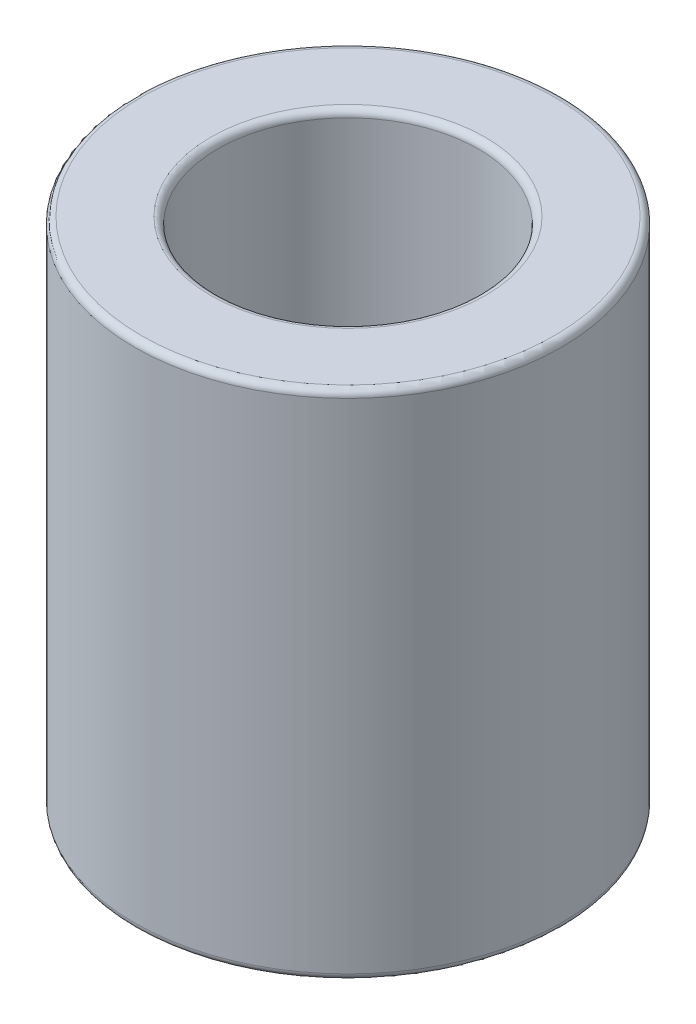
ISO-10303-21;
HEADER;
FILE_DESCRIPTION(('STEP AP214'),'2;1');
FILE_NAME('part.step','',(''),(''),'','','');
FILE_SCHEMA(('AUTOMOTIVE_DESIGN { 1 0 10303 214 1 1 1 1 }'));
ENDSEC;
DATA;
#1=APPLICATION_CONTEXT('core data for automotive mechanical design processes');
#2=APPLICATION_PROTOCOL_DEFINITION('international standard','automotive_design',2000,#1);
#3=PRODUCT_CONTEXT('',#1,'mechanical');
#4=PRODUCT('Part','Part','',(#3));
#5=PRODUCT_RELATED_PRODUCT_CATEGORY('part','',(#4));
#6=PRODUCT_DEFINITION_FORMATION('','',#4);
#7=PRODUCT_DEFINITION_CONTEXT('part definition',#1,'design');
#8=PRODUCT_DEFINITION('design','',#6,#7);
#9=PRODUCT_DEFINITION_SHAPE('','',#8);
#10=(LENGTH_UNIT() NAMED_UNIT(*) SI_UNIT(.MILLI.,.METRE.));
#11=(NAMED_UNIT(*) PLANE_ANGLE_UNIT() SI_UNIT($,.RADIAN.));
#12=(NAMED_UNIT(*) SI_UNIT($,.STERADIAN.) SOLID_ANGLE_UNIT());
#13=UNCERTAINTY_MEASURE_WITH_UNIT(LENGTH_MEASURE(1.E-05),#10,'distance_accuracy_value','');
#14=(GEOMETRIC_REPRESENTATION_CONTEXT(3) GLOBAL_UNCERTAINTY_ASSIGNED_CONTEXT((#13)) GLOBAL_UNIT_ASSIGNED_CONTEXT((#10,
#11,#12)) REPRESENTATION_CONTEXT('',''));
#15=CARTESIAN_POINT('',(0.,0.,0.));
#16=DIRECTION('',(0.,0.,1.));
#17=DIRECTION('',(1.,0.,0.));
#18=AXIS2_PLACEMENT_3D('',#15,#16,#17);
#19=CARTESIAN_POINT('',(0.,19.05,0.));
#20=DIRECTION('',(0.,-1.,0.));
#21=DIRECTION('',(0.,0.,-1.));
#22=AXIS2_PLACEMENT_3D('',#19,#20,#21);
#23=CYLINDRICAL_SURFACE('',#22,4.8514);
#24=CARTESIAN_POINT('',(0.,18.796,0.));
#25=DIRECTION('',(0.,1.,0.));
#26=DIRECTION('',(0.,0.,1.));
#27=AXIS2_PLACEMENT_3D('',#24,#25,#26);
#28=CIRCLE('',#27,4.8514);
#29=CARTESIAN_POINT('',(0.,18.796,4.8514));
#30=VERTEX_POINT('',#29);
#31=EDGE_CURVE('E110',#30,#30,#28,.F.);
#32=ORIENTED_EDGE('',*,*,#31,.F.);
#33=EDGE_LOOP('',(#32));
#34=FACE_BOUND('',#33,.T.);
#35=CARTESIAN_POINT('',(0.,0.254000000000001,0.));
#36=DIRECTION('',(0.,1.,0.));
#37=DIRECTION('',(0.,0.,1.));
#38=AXIS2_PLACEMENT_3D('',#35,#36,#37);
#39=CIRCLE('',#38,4.8514);
#40=CARTESIAN_POINT('',(0.,0.254000000000001,4.8514));
#41=VERTEX_POINT('',#40);
#42=EDGE_CURVE('E113',#41,#41,#39,.T.);
#43=ORIENTED_EDGE('',*,*,#42,.F.);
#44=EDGE_LOOP('',(#43));
#45=FACE_BOUND('',#44,.T.);
#46=ADVANCED_FACE('F15',(#34,#45),#23,.F.);
#47=CARTESIAN_POINT('',(0.,0.254000000000001,0.));
#48=DIRECTION('',(0.,1.,0.));
#49=DIRECTION('',(0.,0.,1.));
#50=AXIS2_PLACEMENT_3D('',#47,#48,#49);
#51=TOROIDAL_SURFACE('',#50,5.1054,0.254);
#52=CARTESIAN_POINT('',(0.,0.,0.));
#53=DIRECTION('',(0.,-1.,0.));
#54=DIRECTION('',(0.,0.,1.));
#55=AXIS2_PLACEMENT_3D('',#52,#53,#54);
#56=CIRCLE('',#55,5.1054);
#57=CARTESIAN_POINT('',(0.,0.,5.1054));
#58=VERTEX_POINT('',#57);
#59=EDGE_CURVE('E66',#58,#58,#56,.T.);
#60=ORIENTED_EDGE('',*,*,#59,.T.);
#61=EDGE_LOOP('',(#60));
#62=FACE_BOUND('',#61,.T.);
#63=ORIENTED_EDGE('',*,*,#42,.T.);
#64=EDGE_LOOP('',(#63));
#65=FACE_BOUND('',#64,.T.);
#66=ADVANCED_FACE('F132',(#62,#65),#51,.T.);
#67=CARTESIAN_POINT('',(0.,18.796,0.));
#68=DIRECTION('',(0.,1.,0.));
#69=DIRECTION('',(0.,0.,1.));
#70=AXIS2_PLACEMENT_3D('',#67,#68,#69);
#71=TOROIDAL_SURFACE('',#70,5.1054,0.254);
#72=ORIENTED_EDGE('',*,*,#31,.T.);
#73=EDGE_LOOP('',(#72));
#74=FACE_BOUND('',#73,.T.);
#75=CARTESIAN_POINT('',(0.,19.05,0.));
#76=DIRECTION('',(0.,1.,0.));
#77=DIRECTION('',(0.,0.,1.));
#78=AXIS2_PLACEMENT_3D('',#75,#76,#77);
#79=CIRCLE('',#78,5.1054);
#80=CARTESIAN_POINT('',(0.,19.05,5.1054));
#81=VERTEX_POINT('',#80);
#82=EDGE_CURVE('E120',#81,#81,#79,.F.);
#83=ORIENTED_EDGE('',*,*,#82,.F.);
#84=EDGE_LOOP('',(#83));
#85=FACE_BOUND('',#84,.T.);
#86=ADVANCED_FACE('F83',(#74,#85),#71,.T.);
#87=CARTESIAN_POINT('',(0.,0.,0.));
#88=DIRECTION('',(0.,1.,0.));
#89=DIRECTION('',(0.,0.,1.));
#90=AXIS2_PLACEMENT_3D('',#87,#88,#89);
#91=PLANE('',#90);
#92=CARTESIAN_POINT('',(0.,0.,0.));
#93=DIRECTION('',(0.,1.,0.));
#94=DIRECTION('',(0.,0.,1.));
#95=AXIS2_PLACEMENT_3D('',#92,#93,#94);
#96=CIRCLE('',#95,7.6835);
#97=CARTESIAN_POINT('',(0.,0.,7.6835));
#98=VERTEX_POINT('',#97);
#99=EDGE_CURVE('E100',#98,#98,#96,.T.);
#100=ORIENTED_EDGE('',*,*,#99,.F.);
#101=EDGE_LOOP('',(#100));
#102=FACE_BOUND('',#101,.T.);
#103=ORIENTED_EDGE('',*,*,#59,.F.);
#104=EDGE_LOOP('',(#103));
#105=FACE_BOUND('',#104,.T.);
#106=ADVANCED_FACE('F73',(#102,#105),#91,.F.);
#107=CARTESIAN_POINT('',(0.,19.05,0.));
#108=DIRECTION('',(0.,1.,0.));
#109=DIRECTION('',(0.,0.,1.));
#110=AXIS2_PLACEMENT_3D('',#107,#108,#109);
#111=PLANE('',#110);
#112=CARTESIAN_POINT('',(0.,19.05,0.));
#113=DIRECTION('',(0.,-1.,0.));
#114=DIRECTION('',(0.,0.,1.));
#115=AXIS2_PLACEMENT_3D('',#112,#113,#114);
#116=CIRCLE('',#115,7.6835);
#117=CARTESIAN_POINT('',(0.,19.05,7.6835));
#118=VERTEX_POINT('',#117);
#119=EDGE_CURVE('E28',#118,#118,#116,.T.);
#120=ORIENTED_EDGE('',*,*,#119,.F.);
#121=EDGE_LOOP('',(#120));
#122=FACE_BOUND('',#121,.T.);
#123=ORIENTED_EDGE('',*,*,#82,.T.);
#124=EDGE_LOOP('',(#123));
#125=FACE_BOUND('',#124,.T.);
#126=ADVANCED_FACE('F82',(#122,#125),#111,.T.);
#127=CARTESIAN_POINT('',(0.,0.254000000000001,0.));
#128=DIRECTION('',(0.,1.,0.));
#129=DIRECTION('',(0.,0.,1.));
#130=AXIS2_PLACEMENT_3D('',#127,#128,#129);
#131=TOROIDAL_SURFACE('',#130,7.6835,0.254);
#132=CARTESIAN_POINT('',(0.,0.254000000000001,0.));
#133=DIRECTION('',(0.,-1.,0.));
#134=DIRECTION('',(0.,0.,-1.));
#135=AXIS2_PLACEMENT_3D('',#132,#133,#134);
#136=CIRCLE('',#135,7.9375);
#137=CARTESIAN_POINT('',(0.,0.254000000000001,-7.9375));
#138=VERTEX_POINT('',#137);
#139=EDGE_CURVE('E23',#138,#138,#136,.F.);
#140=ORIENTED_EDGE('',*,*,#139,.F.);
#141=EDGE_LOOP('',(#140));
#142=FACE_BOUND('',#141,.T.);
#143=ORIENTED_EDGE('',*,*,#99,.T.);
#144=EDGE_LOOP('',(#143));
#145=FACE_BOUND('',#144,.T.);
#146=ADVANCED_FACE('F46',(#142,#145),#131,.T.);
#147=CARTESIAN_POINT('',(0.,18.796,0.));
#148=DIRECTION('',(0.,1.,0.));
#149=DIRECTION('',(0.,0.,1.));
#150=AXIS2_PLACEMENT_3D('',#147,#148,#149);
#151=TOROIDAL_SURFACE('',#150,7.6835,0.254);
#152=ORIENTED_EDGE('',*,*,#119,.T.);
#153=EDGE_LOOP('',(#152));
#154=FACE_BOUND('',#153,.T.);
#155=CARTESIAN_POINT('',(0.,18.796,0.));
#156=DIRECTION('',(0.,-1.,0.));
#157=DIRECTION('',(0.,0.,-1.));
#158=AXIS2_PLACEMENT_3D('',#155,#156,#157);
#159=CIRCLE('',#158,7.9375);
#160=CARTESIAN_POINT('',(0.,18.796,-7.9375));
#161=VERTEX_POINT('',#160);
#162=EDGE_CURVE('E10',#161,#161,#159,.T.);
#163=ORIENTED_EDGE('',*,*,#162,.F.);
#164=EDGE_LOOP('',(#163));
#165=FACE_BOUND('',#164,.T.);
#166=ADVANCED_FACE('F40',(#154,#165),#151,.T.);
#167=CARTESIAN_POINT('',(0.,19.05,0.));
#168=DIRECTION('',(0.,-1.,0.));
#169=DIRECTION('',(0.,0.,-1.));
#170=AXIS2_PLACEMENT_3D('',#167,#168,#169);
#171=CYLINDRICAL_SURFACE('',#170,7.9375);
#172=ORIENTED_EDGE('',*,*,#162,.T.);
#173=EDGE_LOOP('',(#172));
#174=FACE_BOUND('',#173,.T.);
#175=ORIENTED_EDGE('',*,*,#139,.T.);
#176=EDGE_LOOP('',(#175));
#177=FACE_BOUND('',#176,.T.);
#178=ADVANCED_FACE('F45',(#174,#177),#171,.T.);
#179=CLOSED_SHELL('',(#46,#66,#86,#106,#126,#146,#166,#178));
#180=MANIFOLD_SOLID_BREP('B1',#179);
#181=ADVANCED_BREP_SHAPE_REPRESENTATION('',(#18,#180),#14);
#182=SHAPE_DEFINITION_REPRESENTATION(#9,#181);
ENDSEC;
END-ISO-10303-21;
